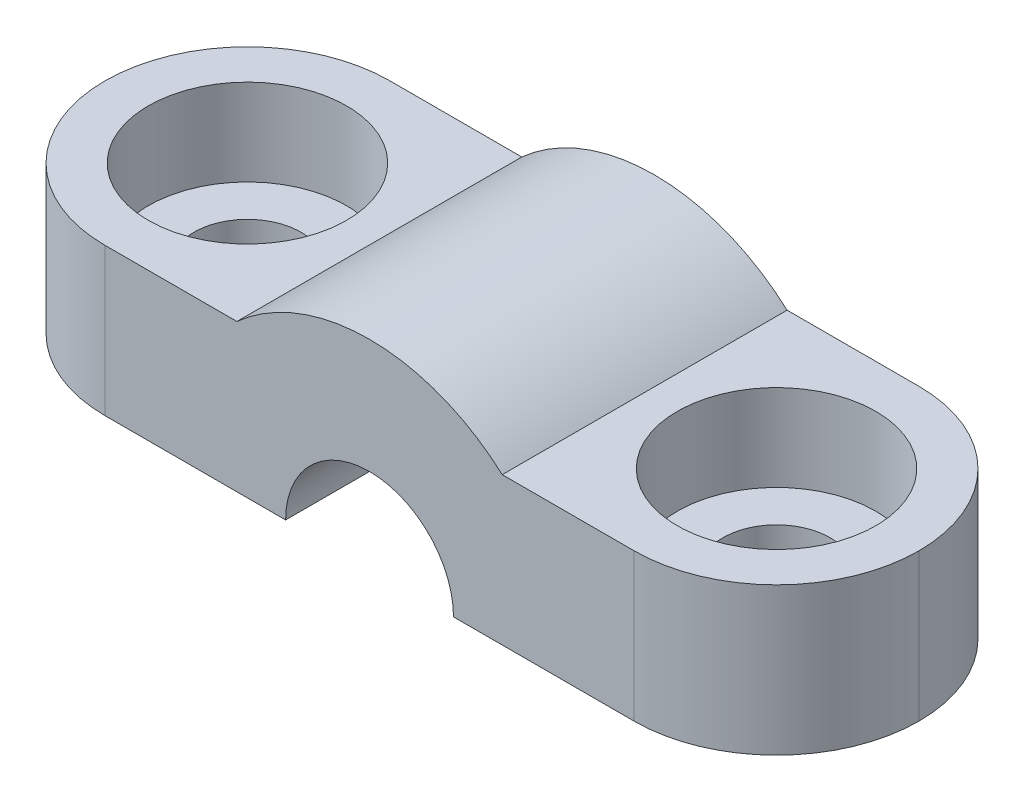
ISO-10303-21;
HEADER;
FILE_DESCRIPTION(('STEP AP214'),'2;1');
FILE_NAME('part.step','',(''),(''),'','','');
FILE_SCHEMA(('AUTOMOTIVE_DESIGN { 1 0 10303 214 1 1 1 1 }'));
ENDSEC;
DATA;
#1=APPLICATION_CONTEXT('core data for automotive mechanical design processes');
#2=APPLICATION_PROTOCOL_DEFINITION('international standard','automotive_design',2000,#1);
#3=PRODUCT_CONTEXT('',#1,'mechanical');
#4=PRODUCT('Part','Part','',(#3));
#5=PRODUCT_RELATED_PRODUCT_CATEGORY('part','',(#4));
#6=PRODUCT_DEFINITION_FORMATION('','',#4);
#7=PRODUCT_DEFINITION_CONTEXT('part definition',#1,'design');
#8=PRODUCT_DEFINITION('design','',#6,#7);
#9=PRODUCT_DEFINITION_SHAPE('','',#8);
#10=(LENGTH_UNIT() NAMED_UNIT(*) SI_UNIT(.MILLI.,.METRE.));
#11=(NAMED_UNIT(*) PLANE_ANGLE_UNIT() SI_UNIT($,.RADIAN.));
#12=(NAMED_UNIT(*) SI_UNIT($,.STERADIAN.) SOLID_ANGLE_UNIT());
#13=UNCERTAINTY_MEASURE_WITH_UNIT(LENGTH_MEASURE(1.E-05),#10,'distance_accuracy_value','');
#14=(GEOMETRIC_REPRESENTATION_CONTEXT(3) GLOBAL_UNCERTAINTY_ASSIGNED_CONTEXT((#13)) GLOBAL_UNIT_ASSIGNED_CONTEXT((#10,
#11,#12)) REPRESENTATION_CONTEXT('',''));
#15=CARTESIAN_POINT('',(0.,0.,0.));
#16=DIRECTION('',(0.,0.,1.));
#17=DIRECTION('',(1.,0.,0.));
#18=AXIS2_PLACEMENT_3D('',#15,#16,#17);
#19=CARTESIAN_POINT('',(20.,0.,7.));
#20=DIRECTION('',(0.,1.,0.));
#21=DIRECTION('',(0.,0.,1.));
#22=AXIS2_PLACEMENT_3D('',#19,#20,#21);
#23=PLANE('',#22);
#24=CARTESIAN_POINT('',(-13.,0.,0.));
#25=DIRECTION('',(0.,1.,0.));
#26=DIRECTION('',(0.,0.,1.));
#27=AXIS2_PLACEMENT_3D('',#24,#25,#26);
#28=CIRCLE('',#27,2.625);
#29=CARTESIAN_POINT('',(-13.,0.,2.625));
#30=VERTEX_POINT('',#29);
#31=EDGE_CURVE('E167',#30,#30,#28,.T.);
#32=ORIENTED_EDGE('',*,*,#31,.T.);
#33=EDGE_LOOP('',(#32));
#34=FACE_BOUND('',#33,.T.);
#35=DIRECTION('',(-1.,0.,0.));
#36=VECTOR('',#35,1.);
#37=CARTESIAN_POINT('',(-20.,0.,-7.));
#38=LINE('',#37,#36);
#39=CARTESIAN_POINT('',(-4.12500000000001,0.,-7.));
#40=VERTEX_POINT('',#39);
#41=CARTESIAN_POINT('',(-13.,0.,-7.));
#42=VERTEX_POINT('',#41);
#43=EDGE_CURVE('E132',#40,#42,#38,.T.);
#44=ORIENTED_EDGE('',*,*,#43,.F.);
#45=DIRECTION('',(0.,0.,1.));
#46=VECTOR('',#45,1.);
#47=CARTESIAN_POINT('',(-4.12500000000001,0.,-7.));
#48=LINE('',#47,#46);
#49=CARTESIAN_POINT('',(-4.12500000000001,0.,7.));
#50=VERTEX_POINT('',#49);
#51=EDGE_CURVE('E11',#40,#50,#48,.T.);
#52=ORIENTED_EDGE('',*,*,#51,.T.);
#53=DIRECTION('',(1.,0.,0.));
#54=VECTOR('',#53,1.);
#55=CARTESIAN_POINT('',(-20.,0.,7.));
#56=LINE('',#55,#54);
#57=CARTESIAN_POINT('',(-13.,0.,7.));
#58=VERTEX_POINT('',#57);
#59=EDGE_CURVE('E123',#58,#50,#56,.T.);
#60=ORIENTED_EDGE('',*,*,#59,.F.);
#61=CARTESIAN_POINT('',(-13.,0.,0.));
#62=DIRECTION('',(0.,1.,0.));
#63=DIRECTION('',(0.,0.,1.));
#64=AXIS2_PLACEMENT_3D('',#61,#62,#63);
#65=CIRCLE('',#64,7.);
#66=CARTESIAN_POINT('',(-20.,0.,0.));
#67=VERTEX_POINT('',#66);
#68=EDGE_CURVE('E144',#58,#67,#65,.F.);
#69=ORIENTED_EDGE('',*,*,#68,.T.);
#70=CARTESIAN_POINT('',(-13.,0.,0.));
#71=DIRECTION('',(0.,1.,0.));
#72=DIRECTION('',(0.,0.,1.));
#73=AXIS2_PLACEMENT_3D('',#70,#71,#72);
#74=CIRCLE('',#73,7.);
#75=EDGE_CURVE('E141',#67,#42,#74,.F.);
#76=ORIENTED_EDGE('',*,*,#75,.T.);
#77=EDGE_LOOP('',(#44,#52,#60,#69,#76));
#78=FACE_BOUND('',#77,.T.);
#79=ADVANCED_FACE('F33',(#34,#78),#23,.F.);
#80=CARTESIAN_POINT('',(20.,7.25,7.));
#81=DIRECTION('',(0.,1.,0.));
#82=DIRECTION('',(0.,0.,1.));
#83=AXIS2_PLACEMENT_3D('',#80,#81,#82);
#84=PLANE('',#83);
#85=DIRECTION('',(0.,0.,1.));
#86=VECTOR('',#85,1.);
#87=CARTESIAN_POINT('',(-6.51920240520265,7.25,-20.2759180473517));
#88=LINE('',#87,#86);
#89=CARTESIAN_POINT('',(-6.51920240520265,7.25,-7.));
#90=VERTEX_POINT('',#89);
#91=CARTESIAN_POINT('',(-6.51920240520265,7.25,7.));
#92=VERTEX_POINT('',#91);
#93=EDGE_CURVE('E190',#90,#92,#88,.T.);
#94=ORIENTED_EDGE('',*,*,#93,.F.);
#95=DIRECTION('',(-1.,0.,0.));
#96=VECTOR('',#95,1.);
#97=CARTESIAN_POINT('',(-20.,7.25,-7.));
#98=LINE('',#97,#96);
#99=CARTESIAN_POINT('',(-13.,7.25,-7.));
#100=VERTEX_POINT('',#99);
#101=EDGE_CURVE('E131',#90,#100,#98,.T.);
#102=ORIENTED_EDGE('',*,*,#101,.T.);
#103=CARTESIAN_POINT('',(-13.,7.25,0.));
#104=DIRECTION('',(0.,1.,0.));
#105=DIRECTION('',(0.,0.,1.));
#106=AXIS2_PLACEMENT_3D('',#103,#104,#105);
#107=CIRCLE('',#106,7.);
#108=CARTESIAN_POINT('',(-20.,7.25,0.));
#109=VERTEX_POINT('',#108);
#110=EDGE_CURVE('E149',#100,#109,#107,.T.);
#111=ORIENTED_EDGE('',*,*,#110,.T.);
#112=CARTESIAN_POINT('',(-13.,7.25,0.));
#113=DIRECTION('',(0.,1.,0.));
#114=DIRECTION('',(0.,0.,1.));
#115=AXIS2_PLACEMENT_3D('',#112,#113,#114);
#116=CIRCLE('',#115,7.);
#117=CARTESIAN_POINT('',(-13.,7.25,7.));
#118=VERTEX_POINT('',#117);
#119=EDGE_CURVE('E151',#109,#118,#116,.T.);
#120=ORIENTED_EDGE('',*,*,#119,.T.);
#121=DIRECTION('',(1.,0.,0.));
#122=VECTOR('',#121,1.);
#123=CARTESIAN_POINT('',(-20.,7.25,7.));
#124=LINE('',#123,#122);
#125=EDGE_CURVE('E139',#118,#92,#124,.T.);
#126=ORIENTED_EDGE('',*,*,#125,.T.);
#127=EDGE_LOOP('',(#94,#102,#111,#120,#126));
#128=FACE_BOUND('',#127,.T.);
#129=CARTESIAN_POINT('',(-13.,7.25,0.));
#130=DIRECTION('',(0.,1.,0.));
#131=DIRECTION('',(0.,0.,1.));
#132=AXIS2_PLACEMENT_3D('',#129,#130,#131);
#133=CIRCLE('',#132,4.875);
#134=CARTESIAN_POINT('',(-13.,7.25,4.875));
#135=VERTEX_POINT('',#134);
#136=EDGE_CURVE('E175',#135,#135,#133,.T.);
#137=ORIENTED_EDGE('',*,*,#136,.F.);
#138=EDGE_LOOP('',(#137));
#139=FACE_BOUND('',#138,.T.);
#140=ADVANCED_FACE('F237',(#128,#139),#84,.T.);
#141=CARTESIAN_POINT('',(-13.,0.,0.));
#142=DIRECTION('',(0.,1.,0.));
#143=DIRECTION('',(0.,0.,1.));
#144=AXIS2_PLACEMENT_3D('',#141,#142,#143);
#145=CYLINDRICAL_SURFACE('',#144,2.625);
#146=CARTESIAN_POINT('',(-13.,3.,0.));
#147=DIRECTION('',(0.,1.,0.));
#148=DIRECTION('',(0.,0.,1.));
#149=AXIS2_PLACEMENT_3D('',#146,#147,#148);
#150=CIRCLE('',#149,2.625);
#151=CARTESIAN_POINT('',(-13.,3.,2.625));
#152=VERTEX_POINT('',#151);
#153=EDGE_CURVE('E168',#152,#152,#150,.F.);
#154=CARTESIAN_POINT('',(-13.,0.,2.625));
#155=CARTESIAN_POINT('',(-13.,0.03125,2.625));
#156=CARTESIAN_POINT('',(-13.,0.0625,2.625));
#157=CARTESIAN_POINT('',(-13.,0.125,2.625));
#158=CARTESIAN_POINT('',(-13.,0.15625,2.625));
#159=CARTESIAN_POINT('',(-13.,0.21875,2.625));
#160=CARTESIAN_POINT('',(-13.,0.25,2.625));
#161=CARTESIAN_POINT('',(-13.,0.3125,2.625));
#162=CARTESIAN_POINT('',(-13.,0.34375,2.625));
#163=CARTESIAN_POINT('',(-13.,0.40625,2.625));
#164=CARTESIAN_POINT('',(-13.,0.4375,2.625));
#165=CARTESIAN_POINT('',(-13.,0.5,2.625));
#166=CARTESIAN_POINT('',(-13.,0.53125,2.625));
#167=CARTESIAN_POINT('',(-13.,0.59375,2.625));
#168=CARTESIAN_POINT('',(-13.,0.625,2.625));
#169=CARTESIAN_POINT('',(-13.,0.6875,2.625));
#170=CARTESIAN_POINT('',(-13.,0.71875,2.625));
#171=CARTESIAN_POINT('',(-13.,0.78125,2.625));
#172=CARTESIAN_POINT('',(-13.,0.8125,2.625));
#173=CARTESIAN_POINT('',(-13.,0.875,2.625));
#174=CARTESIAN_POINT('',(-13.,0.90625,2.625));
#175=CARTESIAN_POINT('',(-13.,0.96875,2.625));
#176=CARTESIAN_POINT('',(-13.,1.,2.625));
#177=CARTESIAN_POINT('',(-13.,1.0625,2.625));
#178=CARTESIAN_POINT('',(-13.,1.09375,2.625));
#179=CARTESIAN_POINT('',(-13.,1.15625,2.625));
#180=CARTESIAN_POINT('',(-13.,1.1875,2.625));
#181=CARTESIAN_POINT('',(-13.,1.25,2.625));
#182=CARTESIAN_POINT('',(-13.,1.28125,2.625));
#183=CARTESIAN_POINT('',(-13.,1.34375,2.625));
#184=CARTESIAN_POINT('',(-13.,1.375,2.625));
#185=CARTESIAN_POINT('',(-13.,1.4375,2.625));
#186=CARTESIAN_POINT('',(-13.,1.46875,2.625));
#187=CARTESIAN_POINT('',(-13.,1.53125,2.625));
#188=CARTESIAN_POINT('',(-13.,1.5625,2.625));
#189=CARTESIAN_POINT('',(-13.,1.625,2.625));
#190=CARTESIAN_POINT('',(-13.,1.65625,2.625));
#191=CARTESIAN_POINT('',(-13.,1.71875,2.625));
#192=CARTESIAN_POINT('',(-13.,1.75,2.625));
#193=CARTESIAN_POINT('',(-13.,1.8125,2.625));
#194=CARTESIAN_POINT('',(-13.,1.84375,2.625));
#195=CARTESIAN_POINT('',(-13.,1.90625,2.625));
#196=CARTESIAN_POINT('',(-13.,1.9375,2.625));
#197=CARTESIAN_POINT('',(-13.,2.,2.625));
#198=CARTESIAN_POINT('',(-13.,2.03125,2.625));
#199=CARTESIAN_POINT('',(-13.,2.09375,2.625));
#200=CARTESIAN_POINT('',(-13.,2.125,2.625));
#201=CARTESIAN_POINT('',(-13.,2.1875,2.625));
#202=CARTESIAN_POINT('',(-13.,2.21875,2.625));
#203=CARTESIAN_POINT('',(-13.,2.28125,2.625));
#204=CARTESIAN_POINT('',(-13.,2.3125,2.625));
#205=CARTESIAN_POINT('',(-13.,2.375,2.625));
#206=CARTESIAN_POINT('',(-13.,2.40625,2.625));
#207=CARTESIAN_POINT('',(-13.,2.46875,2.625));
#208=CARTESIAN_POINT('',(-13.,2.5,2.625));
#209=CARTESIAN_POINT('',(-13.,2.5625,2.625));
#210=CARTESIAN_POINT('',(-13.,2.59375,2.625));
#211=CARTESIAN_POINT('',(-13.,2.65625,2.625));
#212=CARTESIAN_POINT('',(-13.,2.6875,2.625));
#213=CARTESIAN_POINT('',(-13.,2.75,2.625));
#214=CARTESIAN_POINT('',(-13.,2.78125,2.625));
#215=CARTESIAN_POINT('',(-13.,2.84375,2.625));
#216=CARTESIAN_POINT('',(-13.,2.875,2.625));
#217=CARTESIAN_POINT('',(-13.,2.9375,2.625));
#218=CARTESIAN_POINT('',(-13.,2.96875,2.625));
#219=CARTESIAN_POINT('',(-13.,3.,2.625));
#220=B_SPLINE_CURVE_WITH_KNOTS('',3,(#154,#155,#156,#157,#158,#159,#160,#161,#162,#163,#164,
#165,#166,#167,#168,#169,#170,#171,#172,#173,#174,#175,#176,#177,#178,#179,#180,#181,#182,#183,
#184,#185,#186,#187,#188,#189,#190,#191,#192,#193,#194,#195,#196,#197,#198,#199,#200,#201,#202,
#203,#204,#205,#206,#207,#208,#209,#210,#211,#212,#213,#214,#215,#216,#217,#218,#219),
.UNSPECIFIED.,.F.,.F.,(4,2,2,2,2,2,2,2,2,2,2,2,2,2,2,2,2,2,2,2,2,2,2,2,2,2,2,2,2,2,2,2,4),(0.,
0.09375,0.1875,0.28125,0.375,0.46875,0.5625,0.65625,0.75,0.84375,0.9375,1.03125,1.125,1.21875,
1.3125,1.40625,1.5,1.59375,1.6875,1.78125,1.875,1.96875,2.0625,2.15625,2.25,2.34375,2.4375,
2.53125,2.625,2.71875,2.8125,2.90625,3.),.UNSPECIFIED.);
#221=EDGE_CURVE('BSEAM256',#30,#152,#220,.T.);
#222=ORIENTED_EDGE('',*,*,#31,.F.);
#223=ORIENTED_EDGE('',*,*,#153,.F.);
#224=ORIENTED_EDGE('',*,*,#221,.T.);
#225=ORIENTED_EDGE('',*,*,#221,.F.);
#226=EDGE_LOOP('',(#222,#224,#223,#225));
#227=FACE_BOUND('',#226,.T.);
#228=ADVANCED_FACE('F256',(#227),#145,.F.);
#229=CARTESIAN_POINT('',(-20.,7.25,-7.));
#230=DIRECTION('',(0.,0.,1.));
#231=DIRECTION('',(1.,0.,0.));
#232=AXIS2_PLACEMENT_3D('',#229,#230,#231);
#233=PLANE('',#232);
#234=CARTESIAN_POINT('',(13.,0.,-7.));
#235=VERTEX_POINT('',#234);
#236=CARTESIAN_POINT('',(4.12499999999999,0.,-7.));
#237=VERTEX_POINT('',#236);
#238=EDGE_CURVE('E129',#235,#237,#38,.T.);
#239=ORIENTED_EDGE('',*,*,#238,.T.);
#240=CARTESIAN_POINT('',(0.,0.,-7.));
#241=DIRECTION('',(0.,0.,1.));
#242=DIRECTION('',(1.,0.,0.));
#243=AXIS2_PLACEMENT_3D('',#240,#241,#242);
#244=CIRCLE('',#243,4.125);
#245=EDGE_CURVE('E48',#237,#40,#244,.T.);
#246=ORIENTED_EDGE('',*,*,#245,.T.);
#247=ORIENTED_EDGE('',*,*,#43,.T.);
#248=DIRECTION('',(0.,-1.,0.));
#249=VECTOR('',#248,1.);
#250=CARTESIAN_POINT('',(-13.,7.25,-7.));
#251=LINE('',#250,#249);
#252=EDGE_CURVE('E157',#42,#100,#251,.F.);
#253=ORIENTED_EDGE('',*,*,#252,.T.);
#254=ORIENTED_EDGE('',*,*,#101,.F.);
#255=CARTESIAN_POINT('',(0.,0.,-7.));
#256=DIRECTION('',(0.,0.,1.));
#257=DIRECTION('',(1.,0.,0.));
#258=AXIS2_PLACEMENT_3D('',#255,#256,#257);
#259=CIRCLE('',#258,9.75);
#260=CARTESIAN_POINT('',(6.51920240520265,7.25,-7.));
#261=VERTEX_POINT('',#260);
#262=EDGE_CURVE('E187',#90,#261,#259,.F.);
#263=ORIENTED_EDGE('',*,*,#262,.T.);
#264=CARTESIAN_POINT('',(13.,7.25,-7.));
#265=VERTEX_POINT('',#264);
#266=EDGE_CURVE('E56',#265,#261,#98,.T.);
#267=ORIENTED_EDGE('',*,*,#266,.F.);
#268=DIRECTION('',(0.,-1.,0.));
#269=VECTOR('',#268,1.);
#270=CARTESIAN_POINT('',(13.,7.25,-7.));
#271=LINE('',#270,#269);
#272=EDGE_CURVE('E114',#265,#235,#271,.T.);
#273=ORIENTED_EDGE('',*,*,#272,.T.);
#274=EDGE_LOOP('',(#239,#246,#247,#253,#254,#263,#267,#273));
#275=FACE_BOUND('',#274,.T.);
#276=ADVANCED_FACE('F220',(#275),#233,.F.);
#277=CARTESIAN_POINT('',(-20.,7.25,7.));
#278=DIRECTION('',(0.,0.,-1.));
#279=DIRECTION('',(-1.,0.,0.));
#280=AXIS2_PLACEMENT_3D('',#277,#278,#279);
#281=PLANE('',#280);
#282=ORIENTED_EDGE('',*,*,#59,.T.);
#283=CARTESIAN_POINT('',(0.,0.,7.));
#284=DIRECTION('',(0.,0.,1.));
#285=DIRECTION('',(1.,0.,0.));
#286=AXIS2_PLACEMENT_3D('',#283,#284,#285);
#287=CIRCLE('',#286,4.125);
#288=CARTESIAN_POINT('',(4.12499999999999,0.,7.));
#289=VERTEX_POINT('',#288);
#290=EDGE_CURVE('E109',#289,#50,#287,.T.);
#291=ORIENTED_EDGE('',*,*,#290,.F.);
#292=CARTESIAN_POINT('',(13.,0.,7.));
#293=VERTEX_POINT('',#292);
#294=EDGE_CURVE('E119',#289,#293,#56,.T.);
#295=ORIENTED_EDGE('',*,*,#294,.T.);
#296=DIRECTION('',(0.,-1.,0.));
#297=VECTOR('',#296,1.);
#298=CARTESIAN_POINT('',(13.,7.25,7.));
#299=LINE('',#298,#297);
#300=CARTESIAN_POINT('',(13.,7.25,7.));
#301=VERTEX_POINT('',#300);
#302=EDGE_CURVE('E136',#293,#301,#299,.F.);
#303=ORIENTED_EDGE('',*,*,#302,.T.);
#304=CARTESIAN_POINT('',(6.51920240520265,7.25,7.));
#305=VERTEX_POINT('',#304);
#306=EDGE_CURVE('E199',#305,#301,#124,.T.);
#307=ORIENTED_EDGE('',*,*,#306,.F.);
#308=CARTESIAN_POINT('',(0.,0.,7.));
#309=DIRECTION('',(0.,0.,1.));
#310=DIRECTION('',(1.,0.,0.));
#311=AXIS2_PLACEMENT_3D('',#308,#309,#310);
#312=CIRCLE('',#311,9.75);
#313=EDGE_CURVE('E225',#305,#92,#312,.T.);
#314=ORIENTED_EDGE('',*,*,#313,.T.);
#315=ORIENTED_EDGE('',*,*,#125,.F.);
#316=DIRECTION('',(0.,-1.,0.));
#317=VECTOR('',#316,1.);
#318=CARTESIAN_POINT('',(-13.,7.25,7.));
#319=LINE('',#318,#317);
#320=EDGE_CURVE('E138',#118,#58,#319,.T.);
#321=ORIENTED_EDGE('',*,*,#320,.T.);
#322=EDGE_LOOP('',(#282,#291,#295,#303,#307,#314,#315,#321));
#323=FACE_BOUND('',#322,.T.);
#324=ADVANCED_FACE('F117',(#323),#281,.F.);
#325=DIRECTION('',(0.,0.,1.));
#326=VECTOR('',#325,1.);
#327=CARTESIAN_POINT('',(6.51920240520265,7.25,-20.2759180473517));
#328=LINE('',#327,#326);
#329=EDGE_CURVE('E210',#261,#305,#328,.T.);
#330=ORIENTED_EDGE('',*,*,#329,.T.);
#331=ORIENTED_EDGE('',*,*,#306,.T.);
#332=CARTESIAN_POINT('',(13.,7.25,0.));
#333=DIRECTION('',(0.,1.,0.));
#334=DIRECTION('',(0.,0.,1.));
#335=AXIS2_PLACEMENT_3D('',#332,#333,#334);
#336=CIRCLE('',#335,7.);
#337=CARTESIAN_POINT('',(20.,7.25,0.));
#338=VERTEX_POINT('',#337);
#339=EDGE_CURVE('E155',#301,#338,#336,.T.);
#340=ORIENTED_EDGE('',*,*,#339,.T.);
#341=CARTESIAN_POINT('',(13.,7.25,0.));
#342=DIRECTION('',(0.,1.,0.));
#343=DIRECTION('',(0.,0.,1.));
#344=AXIS2_PLACEMENT_3D('',#341,#342,#343);
#345=CIRCLE('',#344,7.);
#346=EDGE_CURVE('E153',#338,#265,#345,.T.);
#347=ORIENTED_EDGE('',*,*,#346,.T.);
#348=ORIENTED_EDGE('',*,*,#266,.T.);
#349=EDGE_LOOP('',(#330,#331,#340,#347,#348));
#350=FACE_BOUND('',#349,.T.);
#351=CARTESIAN_POINT('',(13.,7.25,0.));
#352=DIRECTION('',(0.,1.,0.));
#353=DIRECTION('',(0.,0.,-1.));
#354=AXIS2_PLACEMENT_3D('',#351,#352,#353);
#355=CIRCLE('',#354,4.875);
#356=CARTESIAN_POINT('',(13.,7.25,-4.875));
#357=VERTEX_POINT('',#356);
#358=EDGE_CURVE('E182',#357,#357,#355,.T.);
#359=ORIENTED_EDGE('',*,*,#358,.F.);
#360=EDGE_LOOP('',(#359));
#361=FACE_BOUND('',#360,.T.);
#362=ADVANCED_FACE('F206',(#350,#361),#84,.T.);
#363=CARTESIAN_POINT('',(13.,0.,0.));
#364=DIRECTION('',(0.,1.,0.));
#365=DIRECTION('',(0.,0.,-1.));
#366=AXIS2_PLACEMENT_3D('',#363,#364,#365);
#367=CIRCLE('',#366,2.625);
#368=CARTESIAN_POINT('',(13.,0.,2.625));
#369=VERTEX_POINT('',#368);
#370=EDGE_CURVE('E171',#369,#369,#367,.T.);
#371=ORIENTED_EDGE('',*,*,#370,.T.);
#372=EDGE_LOOP('',(#371));
#373=FACE_BOUND('',#372,.T.);
#374=ORIENTED_EDGE('',*,*,#294,.F.);
#375=DIRECTION('',(0.,0.,1.));
#376=VECTOR('',#375,1.);
#377=CARTESIAN_POINT('',(4.12499999999999,0.,-7.));
#378=LINE('',#377,#376);
#379=EDGE_CURVE('E41',#289,#237,#378,.F.);
#380=ORIENTED_EDGE('',*,*,#379,.T.);
#381=ORIENTED_EDGE('',*,*,#238,.F.);
#382=CARTESIAN_POINT('',(13.,0.,0.));
#383=DIRECTION('',(0.,1.,0.));
#384=DIRECTION('',(0.,0.,1.));
#385=AXIS2_PLACEMENT_3D('',#382,#383,#384);
#386=CIRCLE('',#385,7.);
#387=CARTESIAN_POINT('',(20.,0.,0.));
#388=VERTEX_POINT('',#387);
#389=EDGE_CURVE('E146',#235,#388,#386,.F.);
#390=ORIENTED_EDGE('',*,*,#389,.T.);
#391=CARTESIAN_POINT('',(13.,0.,0.));
#392=DIRECTION('',(0.,1.,0.));
#393=DIRECTION('',(0.,0.,1.));
#394=AXIS2_PLACEMENT_3D('',#391,#392,#393);
#395=CIRCLE('',#394,7.);
#396=EDGE_CURVE('E127',#388,#293,#395,.F.);
#397=ORIENTED_EDGE('',*,*,#396,.T.);
#398=EDGE_LOOP('',(#374,#380,#381,#390,#397));
#399=FACE_BOUND('',#398,.T.);
#400=ADVANCED_FACE('F125',(#373,#399),#23,.F.);
#401=CARTESIAN_POINT('',(-13.,7.25,0.));
#402=DIRECTION('',(0.,-1.,0.));
#403=DIRECTION('',(0.,0.,-1.));
#404=AXIS2_PLACEMENT_3D('',#401,#402,#403);
#405=CYLINDRICAL_SURFACE('',#404,7.);
#406=DIRECTION('',(0.,-1.,0.));
#407=VECTOR('',#406,1.);
#408=CARTESIAN_POINT('',(-20.,7.25,0.));
#409=LINE('',#408,#407);
#410=EDGE_CURVE('E161',#109,#67,#409,.T.);
#411=ORIENTED_EDGE('',*,*,#410,.F.);
#412=ORIENTED_EDGE('',*,*,#110,.F.);
#413=ORIENTED_EDGE('',*,*,#252,.F.);
#414=ORIENTED_EDGE('',*,*,#75,.F.);
#415=EDGE_LOOP('',(#411,#412,#413,#414));
#416=FACE_BOUND('',#415,.T.);
#417=ADVANCED_FACE('F235',(#416),#405,.T.);
#418=CARTESIAN_POINT('',(-13.,7.25,0.));
#419=DIRECTION('',(0.,-1.,0.));
#420=DIRECTION('',(0.,0.,-1.));
#421=AXIS2_PLACEMENT_3D('',#418,#419,#420);
#422=CYLINDRICAL_SURFACE('',#421,7.);
#423=ORIENTED_EDGE('',*,*,#119,.F.);
#424=ORIENTED_EDGE('',*,*,#410,.T.);
#425=ORIENTED_EDGE('',*,*,#68,.F.);
#426=ORIENTED_EDGE('',*,*,#320,.F.);
#427=EDGE_LOOP('',(#423,#424,#425,#426));
#428=FACE_BOUND('',#427,.T.);
#429=ADVANCED_FACE('F241',(#428),#422,.T.);
#430=CARTESIAN_POINT('',(13.,7.25,0.));
#431=DIRECTION('',(0.,-1.,0.));
#432=DIRECTION('',(0.,0.,-1.));
#433=AXIS2_PLACEMENT_3D('',#430,#431,#432);
#434=CYLINDRICAL_SURFACE('',#433,7.);
#435=ORIENTED_EDGE('',*,*,#272,.F.);
#436=ORIENTED_EDGE('',*,*,#346,.F.);
#437=DIRECTION('',(0.,-1.,0.));
#438=VECTOR('',#437,1.);
#439=CARTESIAN_POINT('',(20.,7.25,0.));
#440=LINE('',#439,#438);
#441=EDGE_CURVE('E164',#388,#338,#440,.F.);
#442=ORIENTED_EDGE('',*,*,#441,.F.);
#443=ORIENTED_EDGE('',*,*,#389,.F.);
#444=EDGE_LOOP('',(#435,#436,#442,#443));
#445=FACE_BOUND('',#444,.T.);
#446=ADVANCED_FACE('F35',(#445),#434,.T.);
#447=CARTESIAN_POINT('',(13.,7.25,0.));
#448=DIRECTION('',(0.,-1.,0.));
#449=DIRECTION('',(0.,0.,-1.));
#450=AXIS2_PLACEMENT_3D('',#447,#448,#449);
#451=CYLINDRICAL_SURFACE('',#450,7.);
#452=ORIENTED_EDGE('',*,*,#339,.F.);
#453=ORIENTED_EDGE('',*,*,#302,.F.);
#454=ORIENTED_EDGE('',*,*,#396,.F.);
#455=ORIENTED_EDGE('',*,*,#441,.T.);
#456=EDGE_LOOP('',(#452,#453,#454,#455));
#457=FACE_BOUND('',#456,.T.);
#458=ADVANCED_FACE('F214',(#457),#451,.T.);
#459=CARTESIAN_POINT('',(13.,0.,0.));
#460=DIRECTION('',(0.,1.,0.));
#461=DIRECTION('',(0.,0.,1.));
#462=AXIS2_PLACEMENT_3D('',#459,#460,#461);
#463=CYLINDRICAL_SURFACE('',#462,2.625);
#464=CARTESIAN_POINT('',(13.,3.,0.));
#465=DIRECTION('',(0.,-1.,0.));
#466=DIRECTION('',(0.,0.,-1.));
#467=AXIS2_PLACEMENT_3D('',#464,#465,#466);
#468=CIRCLE('',#467,2.625);
#469=CARTESIAN_POINT('',(13.,3.,2.625));
#470=VERTEX_POINT('',#469);
#471=EDGE_CURVE('E173',#470,#470,#468,.F.);
#472=CARTESIAN_POINT('',(13.,3.,2.625));
#473=CARTESIAN_POINT('',(13.,2.96875,2.625));
#474=CARTESIAN_POINT('',(13.,2.9375,2.625));
#475=CARTESIAN_POINT('',(13.,2.875,2.625));
#476=CARTESIAN_POINT('',(13.,2.84375,2.625));
#477=CARTESIAN_POINT('',(13.,2.78125,2.625));
#478=CARTESIAN_POINT('',(13.,2.75,2.625));
#479=CARTESIAN_POINT('',(13.,2.6875,2.625));
#480=CARTESIAN_POINT('',(13.,2.65625,2.625));
#481=CARTESIAN_POINT('',(13.,2.59375,2.625));
#482=CARTESIAN_POINT('',(13.,2.5625,2.625));
#483=CARTESIAN_POINT('',(13.,2.5,2.625));
#484=CARTESIAN_POINT('',(13.,2.46875,2.625));
#485=CARTESIAN_POINT('',(13.,2.40625,2.625));
#486=CARTESIAN_POINT('',(13.,2.375,2.625));
#487=CARTESIAN_POINT('',(13.,2.3125,2.625));
#488=CARTESIAN_POINT('',(13.,2.28125,2.625));
#489=CARTESIAN_POINT('',(13.,2.21875,2.625));
#490=CARTESIAN_POINT('',(13.,2.1875,2.625));
#491=CARTESIAN_POINT('',(13.,2.125,2.625));
#492=CARTESIAN_POINT('',(13.,2.09375,2.625));
#493=CARTESIAN_POINT('',(13.,2.03125,2.625));
#494=CARTESIAN_POINT('',(13.,2.,2.625));
#495=CARTESIAN_POINT('',(13.,1.9375,2.625));
#496=CARTESIAN_POINT('',(13.,1.90625,2.625));
#497=CARTESIAN_POINT('',(13.,1.84375,2.625));
#498=CARTESIAN_POINT('',(13.,1.8125,2.625));
#499=CARTESIAN_POINT('',(13.,1.75,2.625));
#500=CARTESIAN_POINT('',(13.,1.71875,2.625));
#501=CARTESIAN_POINT('',(13.,1.65625,2.625));
#502=CARTESIAN_POINT('',(13.,1.625,2.625));
#503=CARTESIAN_POINT('',(13.,1.5625,2.625));
#504=CARTESIAN_POINT('',(13.,1.53125,2.625));
#505=CARTESIAN_POINT('',(13.,1.46875,2.625));
#506=CARTESIAN_POINT('',(13.,1.4375,2.625));
#507=CARTESIAN_POINT('',(13.,1.375,2.625));
#508=CARTESIAN_POINT('',(13.,1.34375,2.625));
#509=CARTESIAN_POINT('',(13.,1.28125,2.625));
#510=CARTESIAN_POINT('',(13.,1.25,2.625));
#511=CARTESIAN_POINT('',(13.,1.1875,2.625));
#512=CARTESIAN_POINT('',(13.,1.15625,2.625));
#513=CARTESIAN_POINT('',(13.,1.09375,2.625));
#514=CARTESIAN_POINT('',(13.,1.0625,2.625));
#515=CARTESIAN_POINT('',(13.,1.,2.625));
#516=CARTESIAN_POINT('',(13.,0.96875,2.625));
#517=CARTESIAN_POINT('',(13.,0.90625,2.625));
#518=CARTESIAN_POINT('',(13.,0.875,2.625));
#519=CARTESIAN_POINT('',(13.,0.8125,2.625));
#520=CARTESIAN_POINT('',(13.,0.78125,2.625));
#521=CARTESIAN_POINT('',(13.,0.71875,2.625));
#522=CARTESIAN_POINT('',(13.,0.6875,2.625));
#523=CARTESIAN_POINT('',(13.,0.625,2.625));
#524=CARTESIAN_POINT('',(13.,0.59375,2.625));
#525=CARTESIAN_POINT('',(13.,0.53125,2.625));
#526=CARTESIAN_POINT('',(13.,0.5,2.625));
#527=CARTESIAN_POINT('',(13.,0.4375,2.625));
#528=CARTESIAN_POINT('',(13.,0.40625,2.625));
#529=CARTESIAN_POINT('',(13.,0.34375,2.625));
#530=CARTESIAN_POINT('',(13.,0.3125,2.625));
#531=CARTESIAN_POINT('',(13.,0.25,2.625));
#532=CARTESIAN_POINT('',(13.,0.21875,2.625));
#533=CARTESIAN_POINT('',(13.,0.15625,2.625));
#534=CARTESIAN_POINT('',(13.,0.125,2.625));
#535=CARTESIAN_POINT('',(13.,0.0625000000000001,2.625));
#536=CARTESIAN_POINT('',(13.,0.03125,2.625));
#537=CARTESIAN_POINT('',(13.,0.,2.625));
#538=B_SPLINE_CURVE_WITH_KNOTS('',3,(#472,#473,#474,#475,#476,#477,#478,#479,#480,#481,#482,
#483,#484,#485,#486,#487,#488,#489,#490,#491,#492,#493,#494,#495,#496,#497,#498,#499,#500,#501,
#502,#503,#504,#505,#506,#507,#508,#509,#510,#511,#512,#513,#514,#515,#516,#517,#518,#519,#520,
#521,#522,#523,#524,#525,#526,#527,#528,#529,#530,#531,#532,#533,#534,#535,#536,#537),
.UNSPECIFIED.,.F.,.F.,(4,2,2,2,2,2,2,2,2,2,2,2,2,2,2,2,2,2,2,2,2,2,2,2,2,2,2,2,2,2,2,2,4),(0.,
0.0937500000000001,0.1875,0.28125,0.375,0.46875,0.5625,0.65625,0.75,0.84375,0.9375,1.03125,
1.125,1.21875,1.3125,1.40625,1.5,1.59375,1.6875,1.78125,1.875,1.96875,2.0625,2.15625,2.25,
2.34375,2.4375,2.53125,2.625,2.71875,2.8125,2.90625,3.),.UNSPECIFIED.);
#539=EDGE_CURVE('BSEAM266',#470,#369,#538,.T.);
#540=ORIENTED_EDGE('',*,*,#471,.T.);
#541=ORIENTED_EDGE('',*,*,#370,.F.);
#542=ORIENTED_EDGE('',*,*,#539,.T.);
#543=ORIENTED_EDGE('',*,*,#539,.F.);
#544=EDGE_LOOP('',(#540,#542,#541,#543));
#545=FACE_BOUND('',#544,.T.);
#546=ADVANCED_FACE('F266',(#545),#463,.F.);
#547=CARTESIAN_POINT('',(-13.,3.,0.));
#548=DIRECTION('',(0.,1.,0.));
#549=DIRECTION('',(0.,0.,1.));
#550=AXIS2_PLACEMENT_3D('',#547,#548,#549);
#551=PLANE('',#550);
#552=CARTESIAN_POINT('',(-13.,3.,0.));
#553=DIRECTION('',(0.,1.,0.));
#554=DIRECTION('',(0.,0.,1.));
#555=AXIS2_PLACEMENT_3D('',#552,#553,#554);
#556=CIRCLE('',#555,4.875);
#557=CARTESIAN_POINT('',(-13.,3.,4.875));
#558=VERTEX_POINT('',#557);
#559=EDGE_CURVE('E172',#558,#558,#556,.T.);
#560=ORIENTED_EDGE('',*,*,#559,.T.);
#561=EDGE_LOOP('',(#560));
#562=FACE_BOUND('',#561,.T.);
#563=ORIENTED_EDGE('',*,*,#153,.T.);
#564=EDGE_LOOP('',(#563));
#565=FACE_BOUND('',#564,.T.);
#566=ADVANCED_FACE('F268',(#562,#565),#551,.T.);
#567=CARTESIAN_POINT('',(-13.,3.,0.));
#568=DIRECTION('',(0.,1.,0.));
#569=DIRECTION('',(0.,0.,1.));
#570=AXIS2_PLACEMENT_3D('',#567,#568,#569);
#571=CYLINDRICAL_SURFACE('',#570,4.875);
#572=ORIENTED_EDGE('',*,*,#559,.F.);
#573=EDGE_LOOP('',(#572));
#574=FACE_BOUND('',#573,.T.);
#575=ORIENTED_EDGE('',*,*,#136,.T.);
#576=EDGE_LOOP('',(#575));
#577=FACE_BOUND('',#576,.T.);
#578=ADVANCED_FACE('F274',(#574,#577),#571,.F.);
#579=CARTESIAN_POINT('',(13.,3.,0.));
#580=DIRECTION('',(0.,-1.,0.));
#581=DIRECTION('',(0.,0.,-1.));
#582=AXIS2_PLACEMENT_3D('',#579,#580,#581);
#583=PLANE('',#582);
#584=CARTESIAN_POINT('',(13.,3.,0.));
#585=DIRECTION('',(0.,1.,0.));
#586=DIRECTION('',(0.,0.,-1.));
#587=AXIS2_PLACEMENT_3D('',#584,#585,#586);
#588=CIRCLE('',#587,4.875);
#589=CARTESIAN_POINT('',(13.,3.,-4.875));
#590=VERTEX_POINT('',#589);
#591=EDGE_CURVE('E176',#590,#590,#588,.T.);
#592=ORIENTED_EDGE('',*,*,#591,.T.);
#593=EDGE_LOOP('',(#592));
#594=FACE_BOUND('',#593,.T.);
#595=ORIENTED_EDGE('',*,*,#471,.F.);
#596=EDGE_LOOP('',(#595));
#597=FACE_BOUND('',#596,.T.);
#598=ADVANCED_FACE('F340',(#594,#597),#583,.F.);
#599=CARTESIAN_POINT('',(13.,3.,0.));
#600=DIRECTION('',(0.,1.,0.));
#601=DIRECTION('',(0.,0.,1.));
#602=AXIS2_PLACEMENT_3D('',#599,#600,#601);
#603=CYLINDRICAL_SURFACE('',#602,4.875);
#604=ORIENTED_EDGE('',*,*,#591,.F.);
#605=EDGE_LOOP('',(#604));
#606=FACE_BOUND('',#605,.T.);
#607=ORIENTED_EDGE('',*,*,#358,.T.);
#608=EDGE_LOOP('',(#607));
#609=FACE_BOUND('',#608,.T.);
#610=ADVANCED_FACE('F311',(#606,#609),#603,.F.);
#611=CARTESIAN_POINT('',(0.,0.,-20.2759180473517));
#612=DIRECTION('',(0.,0.,1.));
#613=DIRECTION('',(1.,0.,0.));
#614=AXIS2_PLACEMENT_3D('',#611,#612,#613);
#615=CYLINDRICAL_SURFACE('',#614,9.75);
#616=ORIENTED_EDGE('',*,*,#262,.F.);
#617=ORIENTED_EDGE('',*,*,#93,.T.);
#618=ORIENTED_EDGE('',*,*,#313,.F.);
#619=ORIENTED_EDGE('',*,*,#329,.F.);
#620=EDGE_LOOP('',(#616,#617,#618,#619));
#621=FACE_BOUND('',#620,.T.);
#622=ADVANCED_FACE('F224',(#621),#615,.T.);
#623=CARTESIAN_POINT('',(0.,0.,-7.));
#624=DIRECTION('',(0.,0.,1.));
#625=DIRECTION('',(1.,0.,0.));
#626=AXIS2_PLACEMENT_3D('',#623,#624,#625);
#627=CYLINDRICAL_SURFACE('',#626,4.125);
#628=ORIENTED_EDGE('',*,*,#245,.F.);
#629=ORIENTED_EDGE('',*,*,#379,.F.);
#630=ORIENTED_EDGE('',*,*,#290,.T.);
#631=ORIENTED_EDGE('',*,*,#51,.F.);
#632=EDGE_LOOP('',(#628,#629,#630,#631));
#633=FACE_BOUND('',#632,.T.);
#634=ADVANCED_FACE('F108',(#633),#627,.F.);
#635=CLOSED_SHELL('',(#79,#140,#228,#276,#324,#362,#400,#417,#429,#446,#458,#546,#566,#578,#598,
#610,#622,#634));
#636=MANIFOLD_SOLID_BREP('B2',#635);
#637=ADVANCED_BREP_SHAPE_REPRESENTATION('',(#18,#636),#14);
#638=SHAPE_DEFINITION_REPRESENTATION(#9,#637);
ENDSEC;
END-ISO-10303-21;
